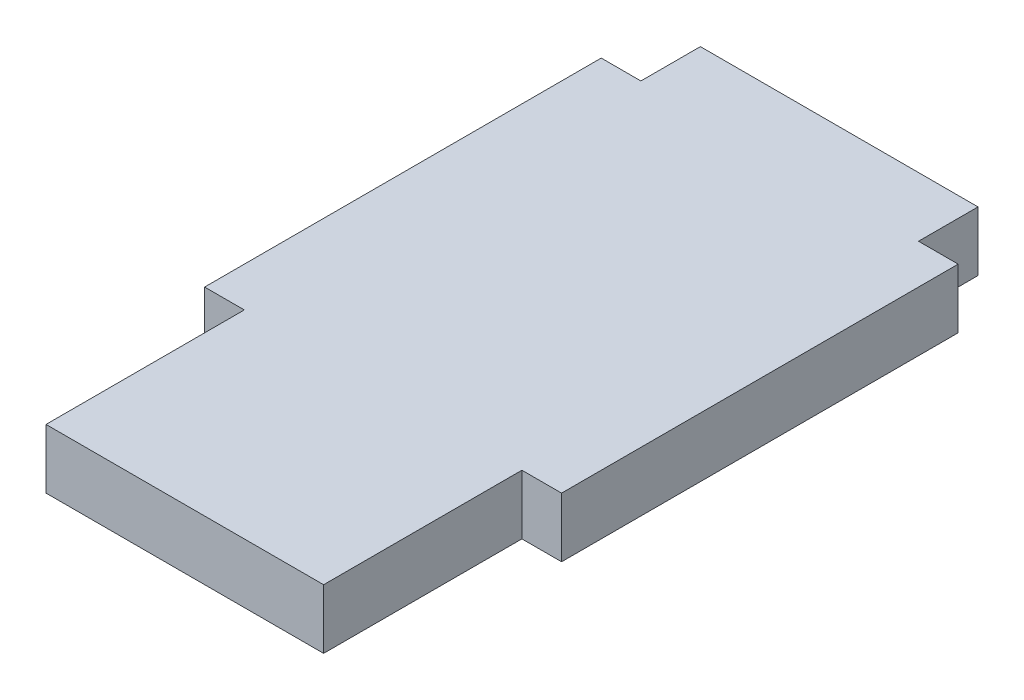
ISO-10303-21;
HEADER;
FILE_DESCRIPTION(('STEP AP214'),'2;1');
FILE_NAME('part.step','',(''),(''),'','','');
FILE_SCHEMA(('AUTOMOTIVE_DESIGN { 1 0 10303 214 1 1 1 1 }'));
ENDSEC;
DATA;
#1=APPLICATION_CONTEXT('core data for automotive mechanical design processes');
#2=APPLICATION_PROTOCOL_DEFINITION('international standard','automotive_design',2000,#1);
#3=PRODUCT_CONTEXT('',#1,'mechanical');
#4=PRODUCT('Part','Part','',(#3));
#5=PRODUCT_RELATED_PRODUCT_CATEGORY('part','',(#4));
#6=PRODUCT_DEFINITION_FORMATION('','',#4);
#7=PRODUCT_DEFINITION_CONTEXT('part definition',#1,'design');
#8=PRODUCT_DEFINITION('design','',#6,#7);
#9=PRODUCT_DEFINITION_SHAPE('','',#8);
#10=(LENGTH_UNIT() NAMED_UNIT(*) SI_UNIT(.MILLI.,.METRE.));
#11=(NAMED_UNIT(*) PLANE_ANGLE_UNIT() SI_UNIT($,.RADIAN.));
#12=(NAMED_UNIT(*) SI_UNIT($,.STERADIAN.) SOLID_ANGLE_UNIT());
#13=UNCERTAINTY_MEASURE_WITH_UNIT(LENGTH_MEASURE(1.E-05),#10,'distance_accuracy_value','');
#14=(GEOMETRIC_REPRESENTATION_CONTEXT(3) GLOBAL_UNCERTAINTY_ASSIGNED_CONTEXT((#13)) GLOBAL_UNIT_ASSIGNED_CONTEXT((#10,
#11,#12)) REPRESENTATION_CONTEXT('',''));
#15=CARTESIAN_POINT('',(0.,0.,0.));
#16=DIRECTION('',(0.,0.,1.));
#17=DIRECTION('',(1.,0.,0.));
#18=AXIS2_PLACEMENT_3D('',#15,#16,#17);
#19=CARTESIAN_POINT('',(-7.,3.,-15.));
#20=DIRECTION('',(1.,0.,0.));
#21=DIRECTION('',(0.,0.,-1.));
#22=AXIS2_PLACEMENT_3D('',#19,#20,#21);
#23=PLANE('',#22);
#24=DIRECTION('',(0.,0.,1.));
#25=VECTOR('',#24,1.);
#26=CARTESIAN_POINT('',(-7.,0.,-15.));
#27=LINE('',#26,#25);
#28=CARTESIAN_POINT('',(-7.,0.,-15.));
#29=VERTEX_POINT('',#28);
#30=CARTESIAN_POINT('',(-7.,0.,-12.));
#31=VERTEX_POINT('',#30);
#32=EDGE_CURVE('E155',#29,#31,#27,.T.);
#33=ORIENTED_EDGE('',*,*,#32,.T.);
#34=DIRECTION('',(0.,-1.,0.));
#35=VECTOR('',#34,1.);
#36=CARTESIAN_POINT('',(-7.,3.,-12.));
#37=LINE('',#36,#35);
#38=CARTESIAN_POINT('',(-7.,3.,-12.));
#39=VERTEX_POINT('',#38);
#40=EDGE_CURVE('E11',#39,#31,#37,.T.);
#41=ORIENTED_EDGE('',*,*,#40,.F.);
#42=DIRECTION('',(0.,0.,1.));
#43=VECTOR('',#42,1.);
#44=CARTESIAN_POINT('',(-7.,3.,-15.));
#45=LINE('',#44,#43);
#46=CARTESIAN_POINT('',(-7.,3.,-15.));
#47=VERTEX_POINT('',#46);
#48=EDGE_CURVE('E188',#47,#39,#45,.T.);
#49=ORIENTED_EDGE('',*,*,#48,.F.);
#50=DIRECTION('',(0.,-1.,0.));
#51=VECTOR('',#50,1.);
#52=CARTESIAN_POINT('',(-7.,3.,-15.));
#53=LINE('',#52,#51);
#54=EDGE_CURVE('E151',#47,#29,#53,.T.);
#55=ORIENTED_EDGE('',*,*,#54,.T.);
#56=EDGE_LOOP('',(#33,#41,#49,#55));
#57=FACE_BOUND('',#56,.T.);
#58=ADVANCED_FACE('F39',(#57),#23,.F.);
#59=CARTESIAN_POINT('',(-9.,3.,-12.));
#60=DIRECTION('',(0.,0.,1.));
#61=DIRECTION('',(1.,0.,0.));
#62=AXIS2_PLACEMENT_3D('',#59,#60,#61);
#63=PLANE('',#62);
#64=DIRECTION('',(-1.,0.,0.));
#65=VECTOR('',#64,1.);
#66=CARTESIAN_POINT('',(-9.,0.,-12.));
#67=LINE('',#66,#65);
#68=CARTESIAN_POINT('',(-9.,0.,-12.));
#69=VERTEX_POINT('',#68);
#70=EDGE_CURVE('E159',#31,#69,#67,.T.);
#71=ORIENTED_EDGE('',*,*,#70,.T.);
#72=DIRECTION('',(0.,-1.,0.));
#73=VECTOR('',#72,1.);
#74=CARTESIAN_POINT('',(-9.,3.,-12.));
#75=LINE('',#74,#73);
#76=CARTESIAN_POINT('',(-9.,3.,-12.));
#77=VERTEX_POINT('',#76);
#78=EDGE_CURVE('E48',#77,#69,#75,.T.);
#79=ORIENTED_EDGE('',*,*,#78,.F.);
#80=DIRECTION('',(-1.,0.,0.));
#81=VECTOR('',#80,1.);
#82=CARTESIAN_POINT('',(-9.,3.,-12.));
#83=LINE('',#82,#81);
#84=EDGE_CURVE('E106',#39,#77,#83,.T.);
#85=ORIENTED_EDGE('',*,*,#84,.F.);
#86=ORIENTED_EDGE('',*,*,#40,.T.);
#87=EDGE_LOOP('',(#71,#79,#85,#86));
#88=FACE_BOUND('',#87,.T.);
#89=ADVANCED_FACE('F277',(#88),#63,.F.);
#90=CARTESIAN_POINT('',(-9.,3.,8.));
#91=DIRECTION('',(1.,0.,0.));
#92=DIRECTION('',(0.,0.,-1.));
#93=AXIS2_PLACEMENT_3D('',#90,#91,#92);
#94=PLANE('',#93);
#95=DIRECTION('',(0.,0.,1.));
#96=VECTOR('',#95,1.);
#97=CARTESIAN_POINT('',(-9.,0.,8.));
#98=LINE('',#97,#96);
#99=CARTESIAN_POINT('',(-9.,0.,8.));
#100=VERTEX_POINT('',#99);
#101=EDGE_CURVE('E163',#69,#100,#98,.T.);
#102=ORIENTED_EDGE('',*,*,#101,.T.);
#103=DIRECTION('',(0.,-1.,0.));
#104=VECTOR('',#103,1.);
#105=CARTESIAN_POINT('',(-9.,3.,8.));
#106=LINE('',#105,#104);
#107=CARTESIAN_POINT('',(-9.,3.,8.));
#108=VERTEX_POINT('',#107);
#109=EDGE_CURVE('E207',#108,#100,#106,.T.);
#110=ORIENTED_EDGE('',*,*,#109,.F.);
#111=DIRECTION('',(0.,0.,1.));
#112=VECTOR('',#111,1.);
#113=CARTESIAN_POINT('',(-9.,3.,8.));
#114=LINE('',#113,#112);
#115=EDGE_CURVE('E217',#77,#108,#114,.T.);
#116=ORIENTED_EDGE('',*,*,#115,.F.);
#117=ORIENTED_EDGE('',*,*,#78,.T.);
#118=EDGE_LOOP('',(#102,#110,#116,#117));
#119=FACE_BOUND('',#118,.T.);
#120=ADVANCED_FACE('F215',(#119),#94,.F.);
#121=CARTESIAN_POINT('',(-9.,3.,8.));
#122=DIRECTION('',(0.,0.,-1.));
#123=DIRECTION('',(-1.,0.,0.));
#124=AXIS2_PLACEMENT_3D('',#121,#122,#123);
#125=PLANE('',#124);
#126=DIRECTION('',(1.,0.,0.));
#127=VECTOR('',#126,1.);
#128=CARTESIAN_POINT('',(-9.,0.,8.));
#129=LINE('',#128,#127);
#130=CARTESIAN_POINT('',(-7.,0.,8.));
#131=VERTEX_POINT('',#130);
#132=EDGE_CURVE('E166',#100,#131,#129,.T.);
#133=ORIENTED_EDGE('',*,*,#132,.T.);
#134=DIRECTION('',(0.,-1.,0.));
#135=VECTOR('',#134,1.);
#136=CARTESIAN_POINT('',(-7.,3.,8.));
#137=LINE('',#136,#135);
#138=CARTESIAN_POINT('',(-7.,3.,8.));
#139=VERTEX_POINT('',#138);
#140=EDGE_CURVE('E203',#139,#131,#137,.T.);
#141=ORIENTED_EDGE('',*,*,#140,.F.);
#142=DIRECTION('',(1.,0.,0.));
#143=VECTOR('',#142,1.);
#144=CARTESIAN_POINT('',(-9.,3.,8.));
#145=LINE('',#144,#143);
#146=EDGE_CURVE('E241',#108,#139,#145,.T.);
#147=ORIENTED_EDGE('',*,*,#146,.F.);
#148=ORIENTED_EDGE('',*,*,#109,.T.);
#149=EDGE_LOOP('',(#133,#141,#147,#148));
#150=FACE_BOUND('',#149,.T.);
#151=ADVANCED_FACE('F226',(#150),#125,.F.);
#152=CARTESIAN_POINT('',(-7.,3.,15.));
#153=DIRECTION('',(1.,0.,0.));
#154=DIRECTION('',(0.,0.,-1.));
#155=AXIS2_PLACEMENT_3D('',#152,#153,#154);
#156=PLANE('',#155);
#157=DIRECTION('',(0.,0.,1.));
#158=VECTOR('',#157,1.);
#159=CARTESIAN_POINT('',(-7.,0.,15.));
#160=LINE('',#159,#158);
#161=CARTESIAN_POINT('',(-7.,0.,18.));
#162=VERTEX_POINT('',#161);
#163=EDGE_CURVE('E169',#131,#162,#160,.T.);
#164=ORIENTED_EDGE('',*,*,#163,.T.);
#165=DIRECTION('',(0.,-1.,0.));
#166=VECTOR('',#165,1.);
#167=CARTESIAN_POINT('',(-7.,3.,18.));
#168=LINE('',#167,#166);
#169=CARTESIAN_POINT('',(-7.,3.,18.));
#170=VERTEX_POINT('',#169);
#171=EDGE_CURVE('E236',#170,#162,#168,.T.);
#172=ORIENTED_EDGE('',*,*,#171,.F.);
#173=DIRECTION('',(0.,0.,1.));
#174=VECTOR('',#173,1.);
#175=CARTESIAN_POINT('',(-7.,3.,15.));
#176=LINE('',#175,#174);
#177=EDGE_CURVE('E234',#139,#170,#176,.T.);
#178=ORIENTED_EDGE('',*,*,#177,.F.);
#179=ORIENTED_EDGE('',*,*,#140,.T.);
#180=EDGE_LOOP('',(#164,#172,#178,#179));
#181=FACE_BOUND('',#180,.T.);
#182=ADVANCED_FACE('F230',(#181),#156,.F.);
#183=CARTESIAN_POINT('',(7.,3.,15.));
#184=DIRECTION('',(-1.,0.,0.));
#185=DIRECTION('',(0.,0.,1.));
#186=AXIS2_PLACEMENT_3D('',#183,#184,#185);
#187=PLANE('',#186);
#188=DIRECTION('',(0.,0.,-1.));
#189=VECTOR('',#188,1.);
#190=CARTESIAN_POINT('',(7.,0.,15.));
#191=LINE('',#190,#189);
#192=CARTESIAN_POINT('',(7.,0.,18.));
#193=VERTEX_POINT('',#192);
#194=CARTESIAN_POINT('',(7.,0.,8.));
#195=VERTEX_POINT('',#194);
#196=EDGE_CURVE('E173',#193,#195,#191,.T.);
#197=ORIENTED_EDGE('',*,*,#196,.T.);
#198=DIRECTION('',(0.,-1.,0.));
#199=VECTOR('',#198,1.);
#200=CARTESIAN_POINT('',(7.,3.,8.));
#201=LINE('',#200,#199);
#202=CARTESIAN_POINT('',(7.,3.,8.));
#203=VERTEX_POINT('',#202);
#204=EDGE_CURVE('E199',#203,#195,#201,.T.);
#205=ORIENTED_EDGE('',*,*,#204,.F.);
#206=DIRECTION('',(0.,0.,-1.));
#207=VECTOR('',#206,1.);
#208=CARTESIAN_POINT('',(7.,3.,15.));
#209=LINE('',#208,#207);
#210=CARTESIAN_POINT('',(7.,3.,18.));
#211=VERTEX_POINT('',#210);
#212=EDGE_CURVE('E240',#211,#203,#209,.T.);
#213=ORIENTED_EDGE('',*,*,#212,.F.);
#214=DIRECTION('',(0.,1.,0.));
#215=VECTOR('',#214,1.);
#216=CARTESIAN_POINT('',(7.,0.,18.));
#217=LINE('',#216,#215);
#218=EDGE_CURVE('E362',#193,#211,#217,.T.);
#219=ORIENTED_EDGE('',*,*,#218,.F.);
#220=EDGE_LOOP('',(#197,#205,#213,#219));
#221=FACE_BOUND('',#220,.T.);
#222=ADVANCED_FACE('F289',(#221),#187,.F.);
#223=CARTESIAN_POINT('',(9.,3.,8.));
#224=DIRECTION('',(0.,0.,-1.));
#225=DIRECTION('',(-1.,0.,0.));
#226=AXIS2_PLACEMENT_3D('',#223,#224,#225);
#227=PLANE('',#226);
#228=DIRECTION('',(1.,0.,0.));
#229=VECTOR('',#228,1.);
#230=CARTESIAN_POINT('',(9.,0.,8.));
#231=LINE('',#230,#229);
#232=CARTESIAN_POINT('',(9.,0.,8.));
#233=VERTEX_POINT('',#232);
#234=EDGE_CURVE('E176',#195,#233,#231,.T.);
#235=ORIENTED_EDGE('',*,*,#234,.T.);
#236=DIRECTION('',(0.,-1.,0.));
#237=VECTOR('',#236,1.);
#238=CARTESIAN_POINT('',(9.,3.,8.));
#239=LINE('',#238,#237);
#240=CARTESIAN_POINT('',(9.,3.,8.));
#241=VERTEX_POINT('',#240);
#242=EDGE_CURVE('E195',#241,#233,#239,.T.);
#243=ORIENTED_EDGE('',*,*,#242,.F.);
#244=DIRECTION('',(1.,0.,0.));
#245=VECTOR('',#244,1.);
#246=CARTESIAN_POINT('',(9.,3.,8.));
#247=LINE('',#246,#245);
#248=EDGE_CURVE('E245',#203,#241,#247,.T.);
#249=ORIENTED_EDGE('',*,*,#248,.F.);
#250=ORIENTED_EDGE('',*,*,#204,.T.);
#251=EDGE_LOOP('',(#235,#243,#249,#250));
#252=FACE_BOUND('',#251,.T.);
#253=ADVANCED_FACE('F257',(#252),#227,.F.);
#254=CARTESIAN_POINT('',(9.,3.,8.));
#255=DIRECTION('',(-1.,0.,0.));
#256=DIRECTION('',(0.,0.,1.));
#257=AXIS2_PLACEMENT_3D('',#254,#255,#256);
#258=PLANE('',#257);
#259=DIRECTION('',(0.,0.,-1.));
#260=VECTOR('',#259,1.);
#261=CARTESIAN_POINT('',(9.,0.,8.));
#262=LINE('',#261,#260);
#263=CARTESIAN_POINT('',(9.,0.,-12.));
#264=VERTEX_POINT('',#263);
#265=EDGE_CURVE('E179',#233,#264,#262,.T.);
#266=ORIENTED_EDGE('',*,*,#265,.T.);
#267=DIRECTION('',(0.,-1.,0.));
#268=VECTOR('',#267,1.);
#269=CARTESIAN_POINT('',(9.,3.,-12.));
#270=LINE('',#269,#268);
#271=CARTESIAN_POINT('',(9.,3.,-12.));
#272=VERTEX_POINT('',#271);
#273=EDGE_CURVE('E144',#272,#264,#270,.T.);
#274=ORIENTED_EDGE('',*,*,#273,.F.);
#275=DIRECTION('',(0.,0.,-1.));
#276=VECTOR('',#275,1.);
#277=CARTESIAN_POINT('',(9.,3.,8.));
#278=LINE('',#277,#276);
#279=EDGE_CURVE('E133',#241,#272,#278,.T.);
#280=ORIENTED_EDGE('',*,*,#279,.F.);
#281=ORIENTED_EDGE('',*,*,#242,.T.);
#282=EDGE_LOOP('',(#266,#274,#280,#281));
#283=FACE_BOUND('',#282,.T.);
#284=ADVANCED_FACE('F261',(#283),#258,.F.);
#285=CARTESIAN_POINT('',(9.,3.,-12.));
#286=DIRECTION('',(0.,0.,1.));
#287=DIRECTION('',(1.,0.,0.));
#288=AXIS2_PLACEMENT_3D('',#285,#286,#287);
#289=PLANE('',#288);
#290=DIRECTION('',(-1.,0.,0.));
#291=VECTOR('',#290,1.);
#292=CARTESIAN_POINT('',(9.,0.,-12.));
#293=LINE('',#292,#291);
#294=CARTESIAN_POINT('',(7.,0.,-12.));
#295=VERTEX_POINT('',#294);
#296=EDGE_CURVE('E142',#264,#295,#293,.T.);
#297=ORIENTED_EDGE('',*,*,#296,.T.);
#298=DIRECTION('',(0.,-1.,0.));
#299=VECTOR('',#298,1.);
#300=CARTESIAN_POINT('',(7.,3.,-12.));
#301=LINE('',#300,#299);
#302=CARTESIAN_POINT('',(7.,3.,-12.));
#303=VERTEX_POINT('',#302);
#304=EDGE_CURVE('E139',#303,#295,#301,.T.);
#305=ORIENTED_EDGE('',*,*,#304,.F.);
#306=DIRECTION('',(-1.,0.,0.));
#307=VECTOR('',#306,1.);
#308=CARTESIAN_POINT('',(9.,3.,-12.));
#309=LINE('',#308,#307);
#310=EDGE_CURVE('E127',#272,#303,#309,.T.);
#311=ORIENTED_EDGE('',*,*,#310,.F.);
#312=ORIENTED_EDGE('',*,*,#273,.T.);
#313=EDGE_LOOP('',(#297,#305,#311,#312));
#314=FACE_BOUND('',#313,.T.);
#315=ADVANCED_FACE('F140',(#314),#289,.F.);
#316=CARTESIAN_POINT('',(7.,3.,-15.));
#317=DIRECTION('',(-1.,0.,0.));
#318=DIRECTION('',(0.,0.,1.));
#319=AXIS2_PLACEMENT_3D('',#316,#317,#318);
#320=PLANE('',#319);
#321=DIRECTION('',(0.,0.,-1.));
#322=VECTOR('',#321,1.);
#323=CARTESIAN_POINT('',(7.,0.,-15.));
#324=LINE('',#323,#322);
#325=CARTESIAN_POINT('',(7.,0.,-15.));
#326=VERTEX_POINT('',#325);
#327=EDGE_CURVE('E92',#295,#326,#324,.T.);
#328=ORIENTED_EDGE('',*,*,#327,.T.);
#329=DIRECTION('',(0.,-1.,0.));
#330=VECTOR('',#329,1.);
#331=CARTESIAN_POINT('',(7.,3.,-15.));
#332=LINE('',#331,#330);
#333=CARTESIAN_POINT('',(7.,3.,-15.));
#334=VERTEX_POINT('',#333);
#335=EDGE_CURVE('E145',#334,#326,#332,.T.);
#336=ORIENTED_EDGE('',*,*,#335,.F.);
#337=DIRECTION('',(0.,0.,-1.));
#338=VECTOR('',#337,1.);
#339=CARTESIAN_POINT('',(7.,3.,-15.));
#340=LINE('',#339,#338);
#341=EDGE_CURVE('E131',#303,#334,#340,.T.);
#342=ORIENTED_EDGE('',*,*,#341,.F.);
#343=ORIENTED_EDGE('',*,*,#304,.T.);
#344=EDGE_LOOP('',(#328,#336,#342,#343));
#345=FACE_BOUND('',#344,.T.);
#346=ADVANCED_FACE('F147',(#345),#320,.F.);
#347=CARTESIAN_POINT('',(-7.,3.,-15.));
#348=DIRECTION('',(0.,0.,1.));
#349=DIRECTION('',(1.,0.,0.));
#350=AXIS2_PLACEMENT_3D('',#347,#348,#349);
#351=PLANE('',#350);
#352=DIRECTION('',(-1.,0.,0.));
#353=VECTOR('',#352,1.);
#354=CARTESIAN_POINT('',(-7.,0.,-15.));
#355=LINE('',#354,#353);
#356=EDGE_CURVE('E98',#326,#29,#355,.T.);
#357=ORIENTED_EDGE('',*,*,#356,.T.);
#358=ORIENTED_EDGE('',*,*,#54,.F.);
#359=DIRECTION('',(-1.,0.,0.));
#360=VECTOR('',#359,1.);
#361=CARTESIAN_POINT('',(-7.,3.,-15.));
#362=LINE('',#361,#360);
#363=EDGE_CURVE('E56',#334,#47,#362,.T.);
#364=ORIENTED_EDGE('',*,*,#363,.F.);
#365=ORIENTED_EDGE('',*,*,#335,.T.);
#366=EDGE_LOOP('',(#357,#358,#364,#365));
#367=FACE_BOUND('',#366,.T.);
#368=ADVANCED_FACE('F265',(#367),#351,.F.);
#369=CARTESIAN_POINT('',(0.,3.,0.));
#370=DIRECTION('',(0.,1.,0.));
#371=DIRECTION('',(0.,0.,1.));
#372=AXIS2_PLACEMENT_3D('',#369,#370,#371);
#373=PLANE('',#372);
#374=ORIENTED_EDGE('',*,*,#48,.T.);
#375=ORIENTED_EDGE('',*,*,#84,.T.);
#376=ORIENTED_EDGE('',*,*,#115,.T.);
#377=ORIENTED_EDGE('',*,*,#146,.T.);
#378=ORIENTED_EDGE('',*,*,#177,.T.);
#379=DIRECTION('',(-1.,0.,0.));
#380=VECTOR('',#379,1.);
#381=CARTESIAN_POINT('',(7.,3.,18.));
#382=LINE('',#381,#380);
#383=EDGE_CURVE('E160',#211,#170,#382,.T.);
#384=ORIENTED_EDGE('',*,*,#383,.F.);
#385=ORIENTED_EDGE('',*,*,#212,.T.);
#386=ORIENTED_EDGE('',*,*,#248,.T.);
#387=ORIENTED_EDGE('',*,*,#279,.T.);
#388=ORIENTED_EDGE('',*,*,#310,.T.);
#389=ORIENTED_EDGE('',*,*,#341,.T.);
#390=ORIENTED_EDGE('',*,*,#363,.T.);
#391=EDGE_LOOP('',(#374,#375,#376,#377,#378,#384,#385,#386,#387,#388,#389,#390));
#392=FACE_BOUND('',#391,.T.);
#393=ADVANCED_FACE('F129',(#392),#373,.T.);
#394=CARTESIAN_POINT('',(0.,0.,0.));
#395=DIRECTION('',(0.,1.,0.));
#396=DIRECTION('',(0.,0.,1.));
#397=AXIS2_PLACEMENT_3D('',#394,#395,#396);
#398=PLANE('',#397);
#399=ORIENTED_EDGE('',*,*,#32,.F.);
#400=ORIENTED_EDGE('',*,*,#356,.F.);
#401=ORIENTED_EDGE('',*,*,#327,.F.);
#402=ORIENTED_EDGE('',*,*,#296,.F.);
#403=ORIENTED_EDGE('',*,*,#265,.F.);
#404=ORIENTED_EDGE('',*,*,#234,.F.);
#405=ORIENTED_EDGE('',*,*,#196,.F.);
#406=DIRECTION('',(1.,0.,0.));
#407=VECTOR('',#406,1.);
#408=CARTESIAN_POINT('',(-7.,0.,18.));
#409=LINE('',#408,#407);
#410=EDGE_CURVE('E356',#162,#193,#409,.T.);
#411=ORIENTED_EDGE('',*,*,#410,.F.);
#412=ORIENTED_EDGE('',*,*,#163,.F.);
#413=ORIENTED_EDGE('',*,*,#132,.F.);
#414=ORIENTED_EDGE('',*,*,#101,.F.);
#415=ORIENTED_EDGE('',*,*,#70,.F.);
#416=EDGE_LOOP('',(#399,#400,#401,#402,#403,#404,#405,#411,#412,#413,#414,#415));
#417=FACE_BOUND('',#416,.T.);
#418=ADVANCED_FACE('F221',(#417),#398,.F.);
#419=CARTESIAN_POINT('',(0.,0.,18.));
#420=DIRECTION('',(0.,0.,1.));
#421=DIRECTION('',(1.,0.,0.));
#422=AXIS2_PLACEMENT_3D('',#419,#420,#421);
#423=PLANE('',#422);
#424=ORIENTED_EDGE('',*,*,#171,.T.);
#425=ORIENTED_EDGE('',*,*,#410,.T.);
#426=ORIENTED_EDGE('',*,*,#218,.T.);
#427=ORIENTED_EDGE('',*,*,#383,.T.);
#428=EDGE_LOOP('',(#424,#425,#426,#427));
#429=FACE_BOUND('',#428,.T.);
#430=ADVANCED_FACE('F341',(#429),#423,.T.);
#431=CLOSED_SHELL('',(#58,#89,#120,#151,#182,#222,#253,#284,#315,#346,#368,#393,#418,#430));
#432=MANIFOLD_SOLID_BREP('B2',#431);
#433=ADVANCED_BREP_SHAPE_REPRESENTATION('',(#18,#432),#14);
#434=SHAPE_DEFINITION_REPRESENTATION(#9,#433);
ENDSEC;
END-ISO-10303-21;
